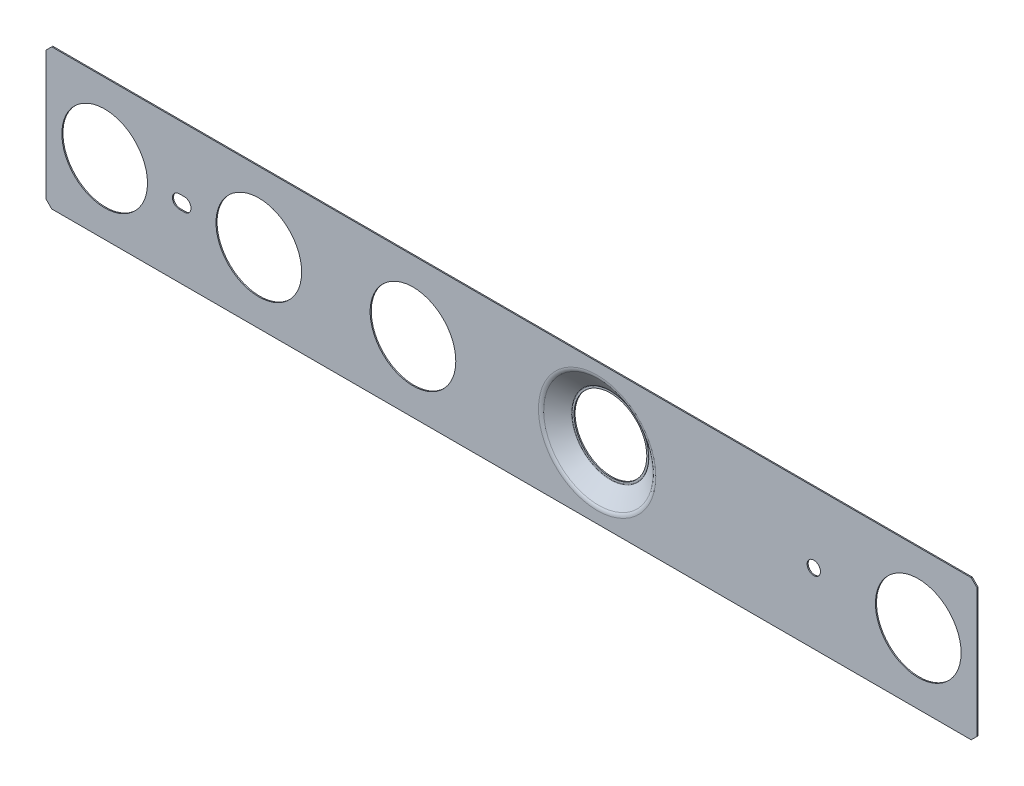
ISO-10303-21;
HEADER;
FILE_DESCRIPTION(('STEP AP214'),'2;1');
FILE_NAME('part.step','',(''),(''),'','','');
FILE_SCHEMA(('AUTOMOTIVE_DESIGN { 1 0 10303 214 1 1 1 1 }'));
ENDSEC;
DATA;
#1=APPLICATION_CONTEXT('core data for automotive mechanical design processes');
#2=APPLICATION_PROTOCOL_DEFINITION('international standard','automotive_design',2000,#1);
#3=PRODUCT_CONTEXT('',#1,'mechanical');
#4=PRODUCT('Part','Part','',(#3));
#5=PRODUCT_RELATED_PRODUCT_CATEGORY('part','',(#4));
#6=PRODUCT_DEFINITION_FORMATION('','',#4);
#7=PRODUCT_DEFINITION_CONTEXT('part definition',#1,'design');
#8=PRODUCT_DEFINITION('design','',#6,#7);
#9=PRODUCT_DEFINITION_SHAPE('','',#8);
#10=(LENGTH_UNIT() NAMED_UNIT(*) SI_UNIT(.MILLI.,.METRE.));
#11=(NAMED_UNIT(*) PLANE_ANGLE_UNIT() SI_UNIT($,.RADIAN.));
#12=(NAMED_UNIT(*) SI_UNIT($,.STERADIAN.) SOLID_ANGLE_UNIT());
#13=UNCERTAINTY_MEASURE_WITH_UNIT(LENGTH_MEASURE(1.E-05),#10,'distance_accuracy_value','');
#14=(GEOMETRIC_REPRESENTATION_CONTEXT(3) GLOBAL_UNCERTAINTY_ASSIGNED_CONTEXT((#13)) GLOBAL_UNIT_ASSIGNED_CONTEXT((#10,
#11,#12)) REPRESENTATION_CONTEXT('',''));
#15=CARTESIAN_POINT('',(0.,0.,0.));
#16=DIRECTION('',(0.,0.,1.));
#17=DIRECTION('',(1.,0.,0.));
#18=AXIS2_PLACEMENT_3D('',#15,#16,#17);
#19=CARTESIAN_POINT('',(10.,0.,-3.87));
#20=DIRECTION('',(0.,0.,1.));
#21=DIRECTION('',(1.,0.,0.));
#22=AXIS2_PLACEMENT_3D('',#19,#20,#21);
#23=PLANE('',#22);
#24=CARTESIAN_POINT('',(10.,0.,-3.87));
#25=DIRECTION('',(0.,0.,1.));
#26=DIRECTION('',(1.,0.,0.));
#27=AXIS2_PLACEMENT_3D('',#24,#25,#26);
#28=CIRCLE('',#27,4.25);
#29=CARTESIAN_POINT('',(14.25,0.,-3.87));
#30=VERTEX_POINT('',#29);
#31=EDGE_CURVE('E235',#30,#30,#28,.F.);
#32=ORIENTED_EDGE('',*,*,#31,.T.);
#33=EDGE_LOOP('',(#32));
#34=FACE_BOUND('',#33,.T.);
#35=CARTESIAN_POINT('',(10.,0.,-3.87));
#36=DIRECTION('',(0.,0.,-1.));
#37=DIRECTION('',(0.,1.,0.));
#38=AXIS2_PLACEMENT_3D('',#35,#36,#37);
#39=CIRCLE('',#38,4.45);
#40=CARTESIAN_POINT('',(10.,-4.45,-3.87));
#41=VERTEX_POINT('',#40);
#42=CARTESIAN_POINT('',(10.,4.45,-3.87));
#43=VERTEX_POINT('',#42);
#44=EDGE_CURVE('E226',#41,#43,#39,.F.);
#45=ORIENTED_EDGE('',*,*,#44,.T.);
#46=CARTESIAN_POINT('',(10.,0.,-3.87));
#47=DIRECTION('',(0.,0.,-1.));
#48=DIRECTION('',(0.,-1.,0.));
#49=AXIS2_PLACEMENT_3D('',#46,#47,#48);
#50=CIRCLE('',#49,4.45);
#51=EDGE_CURVE('E230',#43,#41,#50,.F.);
#52=ORIENTED_EDGE('',*,*,#51,.T.);
#53=EDGE_LOOP('',(#45,#52));
#54=FACE_BOUND('',#53,.T.);
#55=ADVANCED_FACE('F17',(#34,#54),#23,.T.);
#56=CARTESIAN_POINT('',(10.,0.,-3.77));
#57=DIRECTION('',(0.,0.,1.));
#58=DIRECTION('',(0.,1.,0.));
#59=AXIS2_PLACEMENT_3D('',#56,#57,#58);
#60=TOROIDAL_SURFACE('',#59,4.45,0.1);
#61=ORIENTED_EDGE('',*,*,#51,.F.);
#62=ORIENTED_EDGE('',*,*,#44,.F.);
#63=EDGE_LOOP('',(#61,#62));
#64=FACE_BOUND('',#63,.T.);
#65=CARTESIAN_POINT('',(10.,0.,-3.8505370571329));
#66=DIRECTION('',(0.,0.,1.));
#67=DIRECTION('',(0.,1.,0.));
#68=AXIS2_PLACEMENT_3D('',#65,#66,#67);
#69=CIRCLE('',#68,4.50927716616434);
#70=CARTESIAN_POINT('',(10.,4.50927716616434,-3.8505370571329));
#71=VERTEX_POINT('',#70);
#72=EDGE_CURVE('E266',#71,#71,#69,.T.);
#73=ORIENTED_EDGE('',*,*,#72,.T.);
#74=EDGE_LOOP('',(#73));
#75=FACE_BOUND('',#74,.T.);
#76=ADVANCED_FACE('F228',(#64,#75),#60,.F.);
#77=CARTESIAN_POINT('',(10.,0.,-4.079));
#78=DIRECTION('',(0.,0.,1.));
#79=DIRECTION('',(1.,0.,0.));
#80=AXIS2_PLACEMENT_3D('',#77,#78,#79);
#81=CYLINDRICAL_SURFACE('',#80,4.25);
#82=ORIENTED_EDGE('',*,*,#31,.F.);
#83=EDGE_LOOP('',(#82));
#84=FACE_BOUND('',#83,.T.);
#85=CARTESIAN_POINT('',(10.,0.,-3.995));
#86=DIRECTION('',(0.,0.,1.));
#87=DIRECTION('',(1.,0.,0.));
#88=AXIS2_PLACEMENT_3D('',#85,#86,#87);
#89=CIRCLE('',#88,4.25);
#90=CARTESIAN_POINT('',(14.25,0.,-3.995));
#91=VERTEX_POINT('',#90);
#92=EDGE_CURVE('E269',#91,#91,#89,.F.);
#93=ORIENTED_EDGE('',*,*,#92,.T.);
#94=EDGE_LOOP('',(#93));
#95=FACE_BOUND('',#94,.T.);
#96=ADVANCED_FACE('F262',(#84,#95),#81,.F.);
#97=CARTESIAN_POINT('',(10.,0.,-2.46583780739229));
#98=DIRECTION('',(0.,0.,1.));
#99=DIRECTION('',(1.,0.,0.));
#100=AXIS2_PLACEMENT_3D('',#97,#98,#99);
#101=CONICAL_SURFACE('',#100,6.39060196198216,0.93630035294588);
#102=ORIENTED_EDGE('',*,*,#72,.F.);
#103=EDGE_LOOP('',(#102));
#104=FACE_BOUND('',#103,.T.);
#105=CARTESIAN_POINT('',(10.,0.,-2.46583780733411));
#106=DIRECTION('',(0.,0.,1.));
#107=DIRECTION('',(0.,1.,0.));
#108=AXIS2_PLACEMENT_3D('',#105,#106,#107);
#109=CIRCLE('',#108,6.39060196207808);
#110=CARTESIAN_POINT('',(10.,6.39060196207808,-2.46583780733411));
#111=VERTEX_POINT('',#110);
#112=EDGE_CURVE('E270',#111,#111,#109,.F.);
#113=ORIENTED_EDGE('',*,*,#112,.F.);
#114=EDGE_LOOP('',(#113));
#115=FACE_BOUND('',#114,.T.);
#116=ADVANCED_FACE('F476',(#104,#115),#101,.F.);
#117=CARTESIAN_POINT('',(10.,0.,-3.995));
#118=DIRECTION('',(0.,0.,1.));
#119=DIRECTION('',(1.,0.,0.));
#120=AXIS2_PLACEMENT_3D('',#117,#118,#119);
#121=PLANE('',#120);
#122=ORIENTED_EDGE('',*,*,#92,.F.);
#123=EDGE_LOOP('',(#122));
#124=FACE_BOUND('',#123,.T.);
#125=CARTESIAN_POINT('',(10.,0.,-3.995));
#126=DIRECTION('',(0.,0.,1.));
#127=DIRECTION('',(0.,-1.,0.));
#128=AXIS2_PLACEMENT_3D('',#125,#126,#127);
#129=CIRCLE('',#128,4.45);
#130=CARTESIAN_POINT('',(10.,-4.45,-3.995));
#131=VERTEX_POINT('',#130);
#132=CARTESIAN_POINT('',(10.,4.45,-3.995));
#133=VERTEX_POINT('',#132);
#134=EDGE_CURVE('E285',#131,#133,#129,.T.);
#135=ORIENTED_EDGE('',*,*,#134,.F.);
#136=CARTESIAN_POINT('',(10.,0.,-3.995));
#137=DIRECTION('',(0.,0.,1.));
#138=DIRECTION('',(0.,1.,0.));
#139=AXIS2_PLACEMENT_3D('',#136,#137,#138);
#140=CIRCLE('',#139,4.45);
#141=EDGE_CURVE('E273',#133,#131,#140,.T.);
#142=ORIENTED_EDGE('',*,*,#141,.F.);
#143=EDGE_LOOP('',(#135,#142));
#144=FACE_BOUND('',#143,.T.);
#145=ADVANCED_FACE('F206',(#124,#144),#121,.F.);
#146=CARTESIAN_POINT('',(10.,0.,-3.09));
#147=DIRECTION('',(0.,0.,1.));
#148=DIRECTION('',(0.,1.,0.));
#149=AXIS2_PLACEMENT_3D('',#146,#147,#148);
#150=TOROIDAL_SURFACE('',#149,6.85,0.775);
#151=ORIENTED_EDGE('',*,*,#112,.T.);
#152=EDGE_LOOP('',(#151));
#153=FACE_BOUND('',#152,.T.);
#154=CARTESIAN_POINT('',(10.,0.,-2.315));
#155=DIRECTION('',(0.,0.,1.));
#156=DIRECTION('',(0.,1.,0.));
#157=AXIS2_PLACEMENT_3D('',#154,#155,#156);
#158=CIRCLE('',#157,6.85);
#159=CARTESIAN_POINT('',(10.,-6.85,-2.315));
#160=VERTEX_POINT('',#159);
#161=CARTESIAN_POINT('',(10.,6.85,-2.315));
#162=VERTEX_POINT('',#161);
#163=EDGE_CURVE('E196',#160,#162,#158,.F.);
#164=ORIENTED_EDGE('',*,*,#163,.F.);
#165=CARTESIAN_POINT('',(10.,0.,-2.315));
#166=DIRECTION('',(0.,0.,1.));
#167=DIRECTION('',(0.,-1.,0.));
#168=AXIS2_PLACEMENT_3D('',#165,#166,#167);
#169=CIRCLE('',#168,6.85);
#170=EDGE_CURVE('E160',#162,#160,#169,.F.);
#171=ORIENTED_EDGE('',*,*,#170,.F.);
#172=EDGE_LOOP('',(#164,#171));
#173=FACE_BOUND('',#172,.T.);
#174=ADVANCED_FACE('F202',(#153,#173),#150,.T.);
#175=CARTESIAN_POINT('',(10.,0.,-3.77));
#176=DIRECTION('',(0.,0.,1.));
#177=DIRECTION('',(0.,1.,0.));
#178=AXIS2_PLACEMENT_3D('',#175,#176,#177);
#179=TOROIDAL_SURFACE('',#178,4.45,0.225);
#180=ORIENTED_EDGE('',*,*,#141,.T.);
#181=ORIENTED_EDGE('',*,*,#134,.T.);
#182=EDGE_LOOP('',(#180,#181));
#183=FACE_BOUND('',#182,.T.);
#184=CARTESIAN_POINT('',(10.,0.,-3.95120837850982));
#185=DIRECTION('',(0.,0.,1.));
#186=DIRECTION('',(0.,1.,0.));
#187=AXIS2_PLACEMENT_3D('',#184,#185,#186);
#188=CIRCLE('',#187,4.58337362397288);
#189=CARTESIAN_POINT('',(10.,4.58337362397288,-3.95120837850982));
#190=VERTEX_POINT('',#189);
#191=EDGE_CURVE('E138',#190,#190,#188,.T.);
#192=ORIENTED_EDGE('',*,*,#191,.F.);
#193=EDGE_LOOP('',(#192));
#194=FACE_BOUND('',#193,.T.);
#195=ADVANCED_FACE('F177',(#183,#194),#179,.T.);
#196=CARTESIAN_POINT('',(0.,0.,-2.315));
#197=DIRECTION('',(0.,0.,1.));
#198=DIRECTION('',(1.,0.,0.));
#199=AXIS2_PLACEMENT_3D('',#196,#197,#198);
#200=PLANE('',#199);
#201=ORIENTED_EDGE('',*,*,#170,.T.);
#202=ORIENTED_EDGE('',*,*,#163,.T.);
#203=EDGE_LOOP('',(#201,#202));
#204=FACE_BOUND('',#203,.T.);
#205=CARTESIAN_POINT('',(-38.8,0.,-2.315));
#206=DIRECTION('',(0.,0.,1.));
#207=DIRECTION('',(1.,0.,0.));
#208=AXIS2_PLACEMENT_3D('',#205,#206,#207);
#209=CIRCLE('',#208,0.78);
#210=CARTESIAN_POINT('',(-38.8,-0.78,-2.315));
#211=VERTEX_POINT('',#210);
#212=CARTESIAN_POINT('',(-38.8,0.78,-2.315));
#213=VERTEX_POINT('',#212);
#214=EDGE_CURVE('E352',#211,#213,#209,.F.);
#215=ORIENTED_EDGE('',*,*,#214,.T.);
#216=DIRECTION('',(1.,0.,0.));
#217=VECTOR('',#216,1.);
#218=CARTESIAN_POINT('',(-38.2,0.78,-2.315));
#219=LINE('',#218,#217);
#220=CARTESIAN_POINT('',(-38.2,0.78,-2.315));
#221=VERTEX_POINT('',#220);
#222=EDGE_CURVE('E153',#213,#221,#219,.T.);
#223=ORIENTED_EDGE('',*,*,#222,.T.);
#224=CARTESIAN_POINT('',(-38.2,0.,-2.315));
#225=DIRECTION('',(0.,0.,1.));
#226=DIRECTION('',(1.,0.,0.));
#227=AXIS2_PLACEMENT_3D('',#224,#225,#226);
#228=CIRCLE('',#227,0.78);
#229=CARTESIAN_POINT('',(-38.2,-0.78,-2.315));
#230=VERTEX_POINT('',#229);
#231=EDGE_CURVE('E83',#221,#230,#228,.F.);
#232=ORIENTED_EDGE('',*,*,#231,.T.);
#233=DIRECTION('',(1.,0.,0.));
#234=VECTOR('',#233,1.);
#235=CARTESIAN_POINT('',(-38.8,-0.78,-2.315));
#236=LINE('',#235,#234);
#237=EDGE_CURVE('E186',#230,#211,#236,.F.);
#238=ORIENTED_EDGE('',*,*,#237,.T.);
#239=EDGE_LOOP('',(#215,#223,#232,#238));
#240=FACE_BOUND('',#239,.T.);
#241=CARTESIAN_POINT('',(35.3,0.,-2.315));
#242=DIRECTION('',(0.,0.,1.));
#243=DIRECTION('',(1.,0.,0.));
#244=AXIS2_PLACEMENT_3D('',#241,#242,#243);
#245=CIRCLE('',#244,0.78);
#246=CARTESIAN_POINT('',(36.08,0.,-2.315));
#247=VERTEX_POINT('',#246);
#248=EDGE_CURVE('E156',#247,#247,#245,.F.);
#249=ORIENTED_EDGE('',*,*,#248,.T.);
#250=EDGE_LOOP('',(#249));
#251=FACE_BOUND('',#250,.T.);
#252=CARTESIAN_POINT('',(47.5,0.,-2.315));
#253=DIRECTION('',(0.,0.,1.));
#254=DIRECTION('',(1.,0.,0.));
#255=AXIS2_PLACEMENT_3D('',#252,#253,#254);
#256=CIRCLE('',#255,5.);
#257=CARTESIAN_POINT('',(52.5,0.,-2.315));
#258=VERTEX_POINT('',#257);
#259=EDGE_CURVE('E458',#258,#258,#256,.F.);
#260=ORIENTED_EDGE('',*,*,#259,.T.);
#261=EDGE_LOOP('',(#260));
#262=FACE_BOUND('',#261,.T.);
#263=CARTESIAN_POINT('',(-47.5,0.,-2.315));
#264=DIRECTION('',(0.,0.,1.));
#265=DIRECTION('',(1.,0.,0.));
#266=AXIS2_PLACEMENT_3D('',#263,#264,#265);
#267=CIRCLE('',#266,5.);
#268=CARTESIAN_POINT('',(-42.5,0.,-2.315));
#269=VERTEX_POINT('',#268);
#270=EDGE_CURVE('E461',#269,#269,#267,.F.);
#271=ORIENTED_EDGE('',*,*,#270,.T.);
#272=EDGE_LOOP('',(#271));
#273=FACE_BOUND('',#272,.T.);
#274=CARTESIAN_POINT('',(-11.5,0.,-2.315));
#275=DIRECTION('',(0.,0.,1.));
#276=DIRECTION('',(1.,0.,0.));
#277=AXIS2_PLACEMENT_3D('',#274,#275,#276);
#278=CIRCLE('',#277,5.);
#279=CARTESIAN_POINT('',(-6.5,0.,-2.315));
#280=VERTEX_POINT('',#279);
#281=EDGE_CURVE('E464',#280,#280,#278,.F.);
#282=ORIENTED_EDGE('',*,*,#281,.T.);
#283=EDGE_LOOP('',(#282));
#284=FACE_BOUND('',#283,.T.);
#285=CARTESIAN_POINT('',(-29.5,0.,-2.315));
#286=DIRECTION('',(0.,0.,1.));
#287=DIRECTION('',(1.,0.,0.));
#288=AXIS2_PLACEMENT_3D('',#285,#286,#287);
#289=CIRCLE('',#288,5.);
#290=CARTESIAN_POINT('',(-24.5,0.,-2.315));
#291=VERTEX_POINT('',#290);
#292=EDGE_CURVE('E360',#291,#291,#289,.F.);
#293=ORIENTED_EDGE('',*,*,#292,.T.);
#294=EDGE_LOOP('',(#293));
#295=FACE_BOUND('',#294,.T.);
#296=DIRECTION('',(-0.707106781186548,0.707106781186548,0.));
#297=VECTOR('',#296,1.);
#298=CARTESIAN_POINT('',(54.35,7.532893218813,-2.315));
#299=LINE('',#298,#297);
#300=CARTESIAN_POINT('',(53.6828932188104,8.20000000000038,-2.315));
#301=VERTEX_POINT('',#300);
#302=CARTESIAN_POINT('',(54.3500000000001,7.53289321881213,-2.315));
#303=VERTEX_POINT('',#302);
#304=EDGE_CURVE('E95',#301,#303,#299,.F.);
#305=ORIENTED_EDGE('',*,*,#304,.F.);
#306=DIRECTION('',(1.,0.,0.));
#307=VECTOR('',#306,1.);
#308=CARTESIAN_POINT('',(53.68289321881,8.2,-2.315));
#309=LINE('',#308,#307);
#310=CARTESIAN_POINT('',(-53.68289321881,8.2,-2.315));
#311=VERTEX_POINT('',#310);
#312=EDGE_CURVE('E133',#311,#301,#309,.T.);
#313=ORIENTED_EDGE('',*,*,#312,.F.);
#314=DIRECTION('',(-0.707106781186548,-0.707106781186548,0.));
#315=VECTOR('',#314,1.);
#316=CARTESIAN_POINT('',(-53.68289321881,8.2,-2.315));
#317=LINE('',#316,#315);
#318=CARTESIAN_POINT('',(-54.3499999999996,7.53289321881262,-2.315));
#319=VERTEX_POINT('',#318);
#320=EDGE_CURVE('E122',#319,#311,#317,.F.);
#321=ORIENTED_EDGE('',*,*,#320,.F.);
#322=DIRECTION('',(0.,1.,0.));
#323=VECTOR('',#322,1.);
#324=CARTESIAN_POINT('',(-54.35,7.532893218813,-2.315));
#325=LINE('',#324,#323);
#326=CARTESIAN_POINT('',(-54.3500000000001,-7.53289321881213,-2.315));
#327=VERTEX_POINT('',#326);
#328=EDGE_CURVE('E144',#327,#319,#325,.T.);
#329=ORIENTED_EDGE('',*,*,#328,.F.);
#330=DIRECTION('',(0.707106781186548,-0.707106781186548,0.));
#331=VECTOR('',#330,1.);
#332=CARTESIAN_POINT('',(-54.35,-7.532893218813,-2.315));
#333=LINE('',#332,#331);
#334=CARTESIAN_POINT('',(-53.6828932188104,-8.20000000000038,-2.315));
#335=VERTEX_POINT('',#334);
#336=EDGE_CURVE('E382',#335,#327,#333,.F.);
#337=ORIENTED_EDGE('',*,*,#336,.F.);
#338=DIRECTION('',(1.,0.,0.));
#339=VECTOR('',#338,1.);
#340=CARTESIAN_POINT('',(-53.68289321881,-8.2,-2.315));
#341=LINE('',#340,#339);
#342=CARTESIAN_POINT('',(53.68289321881,-8.2,-2.315));
#343=VERTEX_POINT('',#342);
#344=EDGE_CURVE('E377',#343,#335,#341,.F.);
#345=ORIENTED_EDGE('',*,*,#344,.F.);
#346=DIRECTION('',(0.707106781186548,0.707106781186548,0.));
#347=VECTOR('',#346,1.);
#348=CARTESIAN_POINT('',(53.68289321881,-8.2,-2.315));
#349=LINE('',#348,#347);
#350=CARTESIAN_POINT('',(54.3499999999996,-7.53289321881262,-2.315));
#351=VERTEX_POINT('',#350);
#352=EDGE_CURVE('E372',#351,#343,#349,.F.);
#353=ORIENTED_EDGE('',*,*,#352,.F.);
#354=DIRECTION('',(0.,1.,0.));
#355=VECTOR('',#354,1.);
#356=CARTESIAN_POINT('',(54.35,-7.532893218813,-2.315));
#357=LINE('',#356,#355);
#358=EDGE_CURVE('E367',#303,#351,#357,.F.);
#359=ORIENTED_EDGE('',*,*,#358,.F.);
#360=EDGE_LOOP('',(#305,#313,#321,#329,#337,#345,#353,#359));
#361=FACE_BOUND('',#360,.T.);
#362=ADVANCED_FACE('F135',(#204,#240,#251,#262,#273,#284,#295,#361),#200,.T.);
#363=CARTESIAN_POINT('',(10.,0.,-2.56650912876921));
#364=DIRECTION('',(0.,0.,1.));
#365=DIRECTION('',(1.,0.,0.));
#366=AXIS2_PLACEMENT_3D('',#363,#364,#365);
#367=CONICAL_SURFACE('',#366,6.46469841979069,0.93630035294588);
#368=ORIENTED_EDGE('',*,*,#191,.T.);
#369=EDGE_LOOP('',(#368));
#370=FACE_BOUND('',#369,.T.);
#371=CARTESIAN_POINT('',(10.,0.,-2.56650912873209));
#372=DIRECTION('',(0.,0.,1.));
#373=DIRECTION('',(0.,1.,0.));
#374=AXIS2_PLACEMENT_3D('',#371,#372,#373);
#375=CIRCLE('',#374,6.46469841980707);
#376=CARTESIAN_POINT('',(10.,6.46469841980707,-2.56650912873209));
#377=VERTEX_POINT('',#376);
#378=EDGE_CURVE('E149',#377,#377,#375,.F.);
#379=ORIENTED_EDGE('',*,*,#378,.T.);
#380=EDGE_LOOP('',(#379));
#381=FACE_BOUND('',#380,.T.);
#382=ADVANCED_FACE('F176',(#370,#381),#367,.T.);
#383=CARTESIAN_POINT('',(53.68289321881,8.2,-2.44));
#384=DIRECTION('',(0.,1.,0.));
#385=DIRECTION('',(0.,0.,1.));
#386=AXIS2_PLACEMENT_3D('',#383,#384,#385);
#387=PLANE('',#386);
#388=DIRECTION('',(0.,0.,1.));
#389=VECTOR('',#388,1.);
#390=CARTESIAN_POINT('',(53.6828932188115,8.2000000000015,-2.44));
#391=LINE('',#390,#389);
#392=CARTESIAN_POINT('',(53.6828932188104,8.20000000000037,-2.44));
#393=VERTEX_POINT('',#392);
#394=EDGE_CURVE('E362',#393,#301,#391,.T.);
#395=ORIENTED_EDGE('',*,*,#394,.F.);
#396=DIRECTION('',(1.,0.,0.));
#397=VECTOR('',#396,1.);
#398=CARTESIAN_POINT('',(0.,8.2,-2.44));
#399=LINE('',#398,#397);
#400=CARTESIAN_POINT('',(-53.68289321881,8.2,-2.44));
#401=VERTEX_POINT('',#400);
#402=EDGE_CURVE('E143',#393,#401,#399,.F.);
#403=ORIENTED_EDGE('',*,*,#402,.T.);
#404=DIRECTION('',(0.,0.,1.));
#405=VECTOR('',#404,1.);
#406=CARTESIAN_POINT('',(-53.68289321881,8.2,-2.44));
#407=LINE('',#406,#405);
#408=EDGE_CURVE('E127',#311,#401,#407,.F.);
#409=ORIENTED_EDGE('',*,*,#408,.F.);
#410=ORIENTED_EDGE('',*,*,#312,.T.);
#411=EDGE_LOOP('',(#395,#403,#409,#410));
#412=FACE_BOUND('',#411,.T.);
#413=ADVANCED_FACE('F141',(#412),#387,.T.);
#414=CARTESIAN_POINT('',(-53.68289321881,8.2,-2.44));
#415=DIRECTION('',(-0.707106781186548,0.707106781186548,0.));
#416=DIRECTION('',(-0.707106781186548,-0.707106781186548,0.));
#417=AXIS2_PLACEMENT_3D('',#414,#415,#416);
#418=PLANE('',#417);
#419=ORIENTED_EDGE('',*,*,#408,.T.);
#420=DIRECTION('',(-0.707106781188139,-0.707106781184956,0.));
#421=VECTOR('',#420,1.);
#422=CARTESIAN_POINT('',(-53.68289321881,8.2,-2.44));
#423=LINE('',#422,#421);
#424=CARTESIAN_POINT('',(-54.3499999999993,7.53289321881225,-2.44));
#425=VERTEX_POINT('',#424);
#426=EDGE_CURVE('E395',#401,#425,#423,.T.);
#427=ORIENTED_EDGE('',*,*,#426,.T.);
#428=DIRECTION('',(0.,0.,1.));
#429=VECTOR('',#428,1.);
#430=CARTESIAN_POINT('',(-54.35,7.532893218813,-2.44));
#431=LINE('',#430,#429);
#432=EDGE_CURVE('E130',#319,#425,#431,.F.);
#433=ORIENTED_EDGE('',*,*,#432,.F.);
#434=ORIENTED_EDGE('',*,*,#320,.T.);
#435=EDGE_LOOP('',(#419,#427,#433,#434));
#436=FACE_BOUND('',#435,.T.);
#437=ADVANCED_FACE('F124',(#436),#418,.T.);
#438=CARTESIAN_POINT('',(-54.35,7.532893218813,-2.44));
#439=DIRECTION('',(-1.,0.,0.));
#440=DIRECTION('',(0.,0.,1.));
#441=AXIS2_PLACEMENT_3D('',#438,#439,#440);
#442=PLANE('',#441);
#443=ORIENTED_EDGE('',*,*,#432,.T.);
#444=DIRECTION('',(0.,1.,0.));
#445=VECTOR('',#444,1.);
#446=CARTESIAN_POINT('',(-54.35,0.,-2.44));
#447=LINE('',#446,#445);
#448=CARTESIAN_POINT('',(-54.3500000000001,-7.53289321881213,-2.44));
#449=VERTEX_POINT('',#448);
#450=EDGE_CURVE('E390',#425,#449,#447,.F.);
#451=ORIENTED_EDGE('',*,*,#450,.T.);
#452=DIRECTION('',(0.,0.,1.));
#453=VECTOR('',#452,1.);
#454=CARTESIAN_POINT('',(-54.3500000000005,-7.5328932188125,-2.44));
#455=LINE('',#454,#453);
#456=EDGE_CURVE('E379',#327,#449,#455,.F.);
#457=ORIENTED_EDGE('',*,*,#456,.F.);
#458=ORIENTED_EDGE('',*,*,#328,.T.);
#459=EDGE_LOOP('',(#443,#451,#457,#458));
#460=FACE_BOUND('',#459,.T.);
#461=ADVANCED_FACE('F387',(#460),#442,.T.);
#462=CARTESIAN_POINT('',(-54.35,-7.532893218813,-2.44));
#463=DIRECTION('',(-0.707106781186548,-0.707106781186548,0.));
#464=DIRECTION('',(0.707106781186548,-0.707106781186548,0.));
#465=AXIS2_PLACEMENT_3D('',#462,#463,#464);
#466=PLANE('',#465);
#467=ORIENTED_EDGE('',*,*,#456,.T.);
#468=DIRECTION('',(0.707106781187609,-0.707106781185486,0.));
#469=VECTOR('',#468,1.);
#470=CARTESIAN_POINT('',(-54.35,-7.532893218812,-2.44));
#471=LINE('',#470,#469);
#472=CARTESIAN_POINT('',(-53.6828932188107,-8.20000000000075,-2.44));
#473=VERTEX_POINT('',#472);
#474=EDGE_CURVE('E398',#449,#473,#471,.T.);
#475=ORIENTED_EDGE('',*,*,#474,.T.);
#476=DIRECTION('',(0.,0.,-1.));
#477=VECTOR('',#476,1.);
#478=CARTESIAN_POINT('',(-53.68289321881,-8.2,-2.44));
#479=LINE('',#478,#477);
#480=EDGE_CURVE('E374',#335,#473,#479,.T.);
#481=ORIENTED_EDGE('',*,*,#480,.F.);
#482=ORIENTED_EDGE('',*,*,#336,.T.);
#483=EDGE_LOOP('',(#467,#475,#481,#482));
#484=FACE_BOUND('',#483,.T.);
#485=ADVANCED_FACE('F589',(#484),#466,.T.);
#486=CARTESIAN_POINT('',(-53.68289321881,-8.2,-2.44));
#487=DIRECTION('',(0.,-1.,0.));
#488=DIRECTION('',(0.,0.,-1.));
#489=AXIS2_PLACEMENT_3D('',#486,#487,#488);
#490=PLANE('',#489);
#491=ORIENTED_EDGE('',*,*,#480,.T.);
#492=DIRECTION('',(1.,0.,0.));
#493=VECTOR('',#492,1.);
#494=CARTESIAN_POINT('',(0.,-8.2,-2.44));
#495=LINE('',#494,#493);
#496=CARTESIAN_POINT('',(53.68289321881,-8.2,-2.44));
#497=VERTEX_POINT('',#496);
#498=EDGE_CURVE('E402',#473,#497,#495,.T.);
#499=ORIENTED_EDGE('',*,*,#498,.T.);
#500=DIRECTION('',(0.,0.,1.));
#501=VECTOR('',#500,1.);
#502=CARTESIAN_POINT('',(53.68289321881,-8.2,-2.44));
#503=LINE('',#502,#501);
#504=EDGE_CURVE('E369',#343,#497,#503,.F.);
#505=ORIENTED_EDGE('',*,*,#504,.F.);
#506=ORIENTED_EDGE('',*,*,#344,.T.);
#507=EDGE_LOOP('',(#491,#499,#505,#506));
#508=FACE_BOUND('',#507,.T.);
#509=ADVANCED_FACE('F581',(#508),#490,.T.);
#510=CARTESIAN_POINT('',(53.68289321881,-8.2,-2.44));
#511=DIRECTION('',(0.707106781186548,-0.707106781186548,0.));
#512=DIRECTION('',(0.707106781186548,0.707106781186548,0.));
#513=AXIS2_PLACEMENT_3D('',#510,#511,#512);
#514=PLANE('',#513);
#515=ORIENTED_EDGE('',*,*,#504,.T.);
#516=DIRECTION('',(0.707106781188139,0.707106781184956,0.));
#517=VECTOR('',#516,1.);
#518=CARTESIAN_POINT('',(53.68289321881,-8.2,-2.44));
#519=LINE('',#518,#517);
#520=CARTESIAN_POINT('',(54.3499999999993,-7.53289321881225,-2.44));
#521=VERTEX_POINT('',#520);
#522=EDGE_CURVE('E405',#497,#521,#519,.T.);
#523=ORIENTED_EDGE('',*,*,#522,.T.);
#524=DIRECTION('',(0.,0.,-1.));
#525=VECTOR('',#524,1.);
#526=CARTESIAN_POINT('',(54.35,-7.532893218813,-2.44));
#527=LINE('',#526,#525);
#528=EDGE_CURVE('E364',#351,#521,#527,.T.);
#529=ORIENTED_EDGE('',*,*,#528,.F.);
#530=ORIENTED_EDGE('',*,*,#352,.T.);
#531=EDGE_LOOP('',(#515,#523,#529,#530));
#532=FACE_BOUND('',#531,.T.);
#533=ADVANCED_FACE('F573',(#532),#514,.T.);
#534=CARTESIAN_POINT('',(54.35,-7.532893218813,-2.44));
#535=DIRECTION('',(1.,0.,0.));
#536=DIRECTION('',(0.,0.,-1.));
#537=AXIS2_PLACEMENT_3D('',#534,#535,#536);
#538=PLANE('',#537);
#539=ORIENTED_EDGE('',*,*,#528,.T.);
#540=DIRECTION('',(0.,1.,0.));
#541=VECTOR('',#540,1.);
#542=CARTESIAN_POINT('',(54.35,0.,-2.44));
#543=LINE('',#542,#541);
#544=CARTESIAN_POINT('',(54.3500000000001,7.53289321881213,-2.44));
#545=VERTEX_POINT('',#544);
#546=EDGE_CURVE('E408',#521,#545,#543,.T.);
#547=ORIENTED_EDGE('',*,*,#546,.T.);
#548=DIRECTION('',(0.,0.,1.));
#549=VECTOR('',#548,1.);
#550=CARTESIAN_POINT('',(54.3500000000005,7.5328932188125,-2.44));
#551=LINE('',#550,#549);
#552=EDGE_CURVE('E358',#303,#545,#551,.F.);
#553=ORIENTED_EDGE('',*,*,#552,.F.);
#554=ORIENTED_EDGE('',*,*,#358,.T.);
#555=EDGE_LOOP('',(#539,#547,#553,#554));
#556=FACE_BOUND('',#555,.T.);
#557=ADVANCED_FACE('F566',(#556),#538,.T.);
#558=CARTESIAN_POINT('',(54.35,7.532893218813,-2.44));
#559=DIRECTION('',(0.707106781186548,0.707106781186548,0.));
#560=DIRECTION('',(-0.707106781186548,0.707106781186548,0.));
#561=AXIS2_PLACEMENT_3D('',#558,#559,#560);
#562=PLANE('',#561);
#563=ORIENTED_EDGE('',*,*,#552,.T.);
#564=DIRECTION('',(-0.707106781187609,0.707106781185486,0.));
#565=VECTOR('',#564,1.);
#566=CARTESIAN_POINT('',(54.35,7.532893218812,-2.44));
#567=LINE('',#566,#565);
#568=EDGE_CURVE('E411',#545,#393,#567,.T.);
#569=ORIENTED_EDGE('',*,*,#568,.T.);
#570=ORIENTED_EDGE('',*,*,#394,.T.);
#571=ORIENTED_EDGE('',*,*,#304,.T.);
#572=EDGE_LOOP('',(#563,#569,#570,#571));
#573=FACE_BOUND('',#572,.T.);
#574=ADVANCED_FACE('F558',(#573),#562,.T.);
#575=CARTESIAN_POINT('',(-29.5,0.,-2.44));
#576=DIRECTION('',(0.,0.,1.));
#577=DIRECTION('',(1.,0.,0.));
#578=AXIS2_PLACEMENT_3D('',#575,#576,#577);
#579=CYLINDRICAL_SURFACE('',#578,5.);
#580=ORIENTED_EDGE('',*,*,#292,.F.);
#581=EDGE_LOOP('',(#580));
#582=FACE_BOUND('',#581,.T.);
#583=CARTESIAN_POINT('',(-29.5,0.,-2.44));
#584=DIRECTION('',(0.,0.,1.));
#585=DIRECTION('',(1.,0.,0.));
#586=AXIS2_PLACEMENT_3D('',#583,#584,#585);
#587=CIRCLE('',#586,5.);
#588=CARTESIAN_POINT('',(-24.5,0.,-2.44));
#589=VERTEX_POINT('',#588);
#590=EDGE_CURVE('E414',#589,#589,#587,.F.);
#591=ORIENTED_EDGE('',*,*,#590,.T.);
#592=EDGE_LOOP('',(#591));
#593=FACE_BOUND('',#592,.T.);
#594=ADVANCED_FACE('F550',(#582,#593),#579,.F.);
#595=CARTESIAN_POINT('',(-11.5,0.,-2.44));
#596=DIRECTION('',(0.,0.,1.));
#597=DIRECTION('',(1.,0.,0.));
#598=AXIS2_PLACEMENT_3D('',#595,#596,#597);
#599=CYLINDRICAL_SURFACE('',#598,5.);
#600=ORIENTED_EDGE('',*,*,#281,.F.);
#601=EDGE_LOOP('',(#600));
#602=FACE_BOUND('',#601,.T.);
#603=CARTESIAN_POINT('',(-11.5,0.,-2.44));
#604=DIRECTION('',(0.,0.,1.));
#605=DIRECTION('',(1.,0.,0.));
#606=AXIS2_PLACEMENT_3D('',#603,#604,#605);
#607=CIRCLE('',#606,5.);
#608=CARTESIAN_POINT('',(-6.5,0.,-2.44));
#609=VERTEX_POINT('',#608);
#610=EDGE_CURVE('E741',#609,#609,#607,.F.);
#611=ORIENTED_EDGE('',*,*,#610,.T.);
#612=EDGE_LOOP('',(#611));
#613=FACE_BOUND('',#612,.T.);
#614=ADVANCED_FACE('F542',(#602,#613),#599,.F.);
#615=CARTESIAN_POINT('',(-47.5,0.,-2.44));
#616=DIRECTION('',(0.,0.,1.));
#617=DIRECTION('',(1.,0.,0.));
#618=AXIS2_PLACEMENT_3D('',#615,#616,#617);
#619=CYLINDRICAL_SURFACE('',#618,5.);
#620=ORIENTED_EDGE('',*,*,#270,.F.);
#621=EDGE_LOOP('',(#620));
#622=FACE_BOUND('',#621,.T.);
#623=CARTESIAN_POINT('',(-47.5,0.,-2.44));
#624=DIRECTION('',(0.,0.,1.));
#625=DIRECTION('',(1.,0.,0.));
#626=AXIS2_PLACEMENT_3D('',#623,#624,#625);
#627=CIRCLE('',#626,5.);
#628=CARTESIAN_POINT('',(-42.5,0.,-2.44));
#629=VERTEX_POINT('',#628);
#630=EDGE_CURVE('E743',#629,#629,#627,.F.);
#631=ORIENTED_EDGE('',*,*,#630,.T.);
#632=EDGE_LOOP('',(#631));
#633=FACE_BOUND('',#632,.T.);
#634=ADVANCED_FACE('F534',(#622,#633),#619,.F.);
#635=CARTESIAN_POINT('',(47.5,0.,-2.44));
#636=DIRECTION('',(0.,0.,1.));
#637=DIRECTION('',(1.,0.,0.));
#638=AXIS2_PLACEMENT_3D('',#635,#636,#637);
#639=CYLINDRICAL_SURFACE('',#638,5.);
#640=ORIENTED_EDGE('',*,*,#259,.F.);
#641=EDGE_LOOP('',(#640));
#642=FACE_BOUND('',#641,.T.);
#643=CARTESIAN_POINT('',(47.5,0.,-2.44));
#644=DIRECTION('',(0.,0.,1.));
#645=DIRECTION('',(1.,0.,0.));
#646=AXIS2_PLACEMENT_3D('',#643,#644,#645);
#647=CIRCLE('',#646,5.);
#648=CARTESIAN_POINT('',(52.5,0.,-2.44));
#649=VERTEX_POINT('',#648);
#650=EDGE_CURVE('E747',#649,#649,#647,.F.);
#651=ORIENTED_EDGE('',*,*,#650,.T.);
#652=EDGE_LOOP('',(#651));
#653=FACE_BOUND('',#652,.T.);
#654=ADVANCED_FACE('F526',(#642,#653),#639,.F.);
#655=CARTESIAN_POINT('',(35.3,0.,-2.315));
#656=DIRECTION('',(0.,0.,1.));
#657=DIRECTION('',(1.,0.,0.));
#658=AXIS2_PLACEMENT_3D('',#655,#656,#657);
#659=CYLINDRICAL_SURFACE('',#658,0.78);
#660=ORIENTED_EDGE('',*,*,#248,.F.);
#661=EDGE_LOOP('',(#660));
#662=FACE_BOUND('',#661,.T.);
#663=CARTESIAN_POINT('',(35.3,0.,-2.44));
#664=DIRECTION('',(0.,0.,1.));
#665=DIRECTION('',(1.,0.,0.));
#666=AXIS2_PLACEMENT_3D('',#663,#664,#665);
#667=CIRCLE('',#666,0.78);
#668=CARTESIAN_POINT('',(36.08,0.,-2.44));
#669=VERTEX_POINT('',#668);
#670=EDGE_CURVE('E419',#669,#669,#667,.F.);
#671=ORIENTED_EDGE('',*,*,#670,.T.);
#672=EDGE_LOOP('',(#671));
#673=FACE_BOUND('',#672,.T.);
#674=ADVANCED_FACE('F519',(#662,#673),#659,.F.);
#675=CARTESIAN_POINT('',(-38.2,0.78,-2.315));
#676=DIRECTION('',(0.,1.,0.));
#677=DIRECTION('',(0.,0.,1.));
#678=AXIS2_PLACEMENT_3D('',#675,#676,#677);
#679=PLANE('',#678);
#680=ORIENTED_EDGE('',*,*,#222,.F.);
#681=DIRECTION('',(0.,0.,1.));
#682=VECTOR('',#681,1.);
#683=CARTESIAN_POINT('',(-38.8,0.78,-2.315));
#684=LINE('',#683,#682);
#685=CARTESIAN_POINT('',(-38.8,0.78,-2.44));
#686=VERTEX_POINT('',#685);
#687=EDGE_CURVE('E152',#213,#686,#684,.F.);
#688=ORIENTED_EDGE('',*,*,#687,.T.);
#689=DIRECTION('',(1.,0.,0.));
#690=VECTOR('',#689,1.);
#691=CARTESIAN_POINT('',(0.,0.78,-2.44));
#692=LINE('',#691,#690);
#693=CARTESIAN_POINT('',(-38.2,0.78,-2.44));
#694=VERTEX_POINT('',#693);
#695=EDGE_CURVE('E415',#686,#694,#692,.T.);
#696=ORIENTED_EDGE('',*,*,#695,.T.);
#697=DIRECTION('',(0.,0.,1.));
#698=VECTOR('',#697,1.);
#699=CARTESIAN_POINT('',(-38.2,0.78,-2.315));
#700=LINE('',#699,#698);
#701=EDGE_CURVE('E155',#694,#221,#700,.T.);
#702=ORIENTED_EDGE('',*,*,#701,.T.);
#703=EDGE_LOOP('',(#680,#688,#696,#702));
#704=FACE_BOUND('',#703,.T.);
#705=ADVANCED_FACE('F449',(#704),#679,.F.);
#706=CARTESIAN_POINT('',(-38.2,0.,-2.315));
#707=DIRECTION('',(0.,0.,1.));
#708=DIRECTION('',(1.,0.,0.));
#709=AXIS2_PLACEMENT_3D('',#706,#707,#708);
#710=CYLINDRICAL_SURFACE('',#709,0.78);
#711=ORIENTED_EDGE('',*,*,#231,.F.);
#712=ORIENTED_EDGE('',*,*,#701,.F.);
#713=CARTESIAN_POINT('',(-38.2,0.,-2.44));
#714=DIRECTION('',(0.,0.,1.));
#715=DIRECTION('',(1.,0.,0.));
#716=AXIS2_PLACEMENT_3D('',#713,#714,#715);
#717=CIRCLE('',#716,0.78);
#718=CARTESIAN_POINT('',(-38.2,-0.78,-2.44));
#719=VERTEX_POINT('',#718);
#720=EDGE_CURVE('E418',#694,#719,#717,.F.);
#721=ORIENTED_EDGE('',*,*,#720,.T.);
#722=DIRECTION('',(0.,0.,-1.));
#723=VECTOR('',#722,1.);
#724=CARTESIAN_POINT('',(-38.2,-0.78,-2.315));
#725=LINE('',#724,#723);
#726=EDGE_CURVE('E194',#719,#230,#725,.F.);
#727=ORIENTED_EDGE('',*,*,#726,.T.);
#728=EDGE_LOOP('',(#711,#712,#721,#727));
#729=FACE_BOUND('',#728,.T.);
#730=ADVANCED_FACE('F506',(#729),#710,.F.);
#731=CARTESIAN_POINT('',(-38.8,-0.78,-2.315));
#732=DIRECTION('',(0.,-1.,0.));
#733=DIRECTION('',(0.,0.,-1.));
#734=AXIS2_PLACEMENT_3D('',#731,#732,#733);
#735=PLANE('',#734);
#736=ORIENTED_EDGE('',*,*,#237,.F.);
#737=ORIENTED_EDGE('',*,*,#726,.F.);
#738=DIRECTION('',(1.,0.,0.));
#739=VECTOR('',#738,1.);
#740=CARTESIAN_POINT('',(0.,-0.78,-2.44));
#741=LINE('',#740,#739);
#742=CARTESIAN_POINT('',(-38.8,-0.78,-2.44));
#743=VERTEX_POINT('',#742);
#744=EDGE_CURVE('E420',#719,#743,#741,.F.);
#745=ORIENTED_EDGE('',*,*,#744,.T.);
#746=DIRECTION('',(0.,0.,1.));
#747=VECTOR('',#746,1.);
#748=CARTESIAN_POINT('',(-38.8,-0.78,-2.315));
#749=LINE('',#748,#747);
#750=EDGE_CURVE('E193',#743,#211,#749,.T.);
#751=ORIENTED_EDGE('',*,*,#750,.T.);
#752=EDGE_LOOP('',(#736,#737,#745,#751));
#753=FACE_BOUND('',#752,.T.);
#754=ADVANCED_FACE('F500',(#753),#735,.F.);
#755=CARTESIAN_POINT('',(-38.8,0.,-2.315));
#756=DIRECTION('',(0.,0.,1.));
#757=DIRECTION('',(1.,0.,0.));
#758=AXIS2_PLACEMENT_3D('',#755,#756,#757);
#759=CYLINDRICAL_SURFACE('',#758,0.78);
#760=ORIENTED_EDGE('',*,*,#214,.F.);
#761=ORIENTED_EDGE('',*,*,#750,.F.);
#762=CARTESIAN_POINT('',(-38.8,0.,-2.44));
#763=DIRECTION('',(0.,0.,1.));
#764=DIRECTION('',(1.,0.,0.));
#765=AXIS2_PLACEMENT_3D('',#762,#763,#764);
#766=CIRCLE('',#765,0.78);
#767=EDGE_CURVE('E251',#743,#686,#766,.F.);
#768=ORIENTED_EDGE('',*,*,#767,.T.);
#769=ORIENTED_EDGE('',*,*,#687,.F.);
#770=EDGE_LOOP('',(#760,#761,#768,#769));
#771=FACE_BOUND('',#770,.T.);
#772=ADVANCED_FACE('F331',(#771),#759,.F.);
#773=CARTESIAN_POINT('',(10.,0.,-3.09));
#774=DIRECTION('',(0.,0.,1.));
#775=DIRECTION('',(0.,1.,0.));
#776=AXIS2_PLACEMENT_3D('',#773,#774,#775);
#777=TOROIDAL_SURFACE('',#776,6.85,0.65);
#778=ORIENTED_EDGE('',*,*,#378,.F.);
#779=EDGE_LOOP('',(#778));
#780=FACE_BOUND('',#779,.T.);
#781=CARTESIAN_POINT('',(10.,0.,-2.44));
#782=DIRECTION('',(0.,0.,-1.));
#783=DIRECTION('',(0.,-1.,0.));
#784=AXIS2_PLACEMENT_3D('',#781,#782,#783);
#785=CIRCLE('',#784,6.85);
#786=CARTESIAN_POINT('',(10.,-6.85,-2.44));
#787=VERTEX_POINT('',#786);
#788=CARTESIAN_POINT('',(10.,6.85,-2.44));
#789=VERTEX_POINT('',#788);
#790=EDGE_CURVE('E28',#787,#789,#785,.T.);
#791=ORIENTED_EDGE('',*,*,#790,.T.);
#792=CARTESIAN_POINT('',(10.,0.,-2.44));
#793=DIRECTION('',(0.,0.,-1.));
#794=DIRECTION('',(0.,1.,0.));
#795=AXIS2_PLACEMENT_3D('',#792,#793,#794);
#796=CIRCLE('',#795,6.85);
#797=EDGE_CURVE('E11',#789,#787,#796,.T.);
#798=ORIENTED_EDGE('',*,*,#797,.T.);
#799=EDGE_LOOP('',(#791,#798));
#800=FACE_BOUND('',#799,.T.);
#801=ADVANCED_FACE('F319',(#780,#800),#777,.F.);
#802=CARTESIAN_POINT('',(0.,0.,-2.44));
#803=DIRECTION('',(0.,0.,1.));
#804=DIRECTION('',(1.,0.,0.));
#805=AXIS2_PLACEMENT_3D('',#802,#803,#804);
#806=PLANE('',#805);
#807=ORIENTED_EDGE('',*,*,#790,.F.);
#808=ORIENTED_EDGE('',*,*,#797,.F.);
#809=EDGE_LOOP('',(#807,#808));
#810=FACE_BOUND('',#809,.T.);
#811=ORIENTED_EDGE('',*,*,#767,.F.);
#812=ORIENTED_EDGE('',*,*,#744,.F.);
#813=ORIENTED_EDGE('',*,*,#720,.F.);
#814=ORIENTED_EDGE('',*,*,#695,.F.);
#815=EDGE_LOOP('',(#811,#812,#813,#814));
#816=FACE_BOUND('',#815,.T.);
#817=ORIENTED_EDGE('',*,*,#670,.F.);
#818=EDGE_LOOP('',(#817));
#819=FACE_BOUND('',#818,.T.);
#820=ORIENTED_EDGE('',*,*,#650,.F.);
#821=EDGE_LOOP('',(#820));
#822=FACE_BOUND('',#821,.T.);
#823=ORIENTED_EDGE('',*,*,#630,.F.);
#824=EDGE_LOOP('',(#823));
#825=FACE_BOUND('',#824,.T.);
#826=ORIENTED_EDGE('',*,*,#610,.F.);
#827=EDGE_LOOP('',(#826));
#828=FACE_BOUND('',#827,.T.);
#829=ORIENTED_EDGE('',*,*,#590,.F.);
#830=EDGE_LOOP('',(#829));
#831=FACE_BOUND('',#830,.T.);
#832=ORIENTED_EDGE('',*,*,#546,.F.);
#833=ORIENTED_EDGE('',*,*,#522,.F.);
#834=ORIENTED_EDGE('',*,*,#498,.F.);
#835=ORIENTED_EDGE('',*,*,#474,.F.);
#836=ORIENTED_EDGE('',*,*,#450,.F.);
#837=ORIENTED_EDGE('',*,*,#426,.F.);
#838=ORIENTED_EDGE('',*,*,#402,.F.);
#839=ORIENTED_EDGE('',*,*,#568,.F.);
#840=EDGE_LOOP('',(#832,#833,#834,#835,#836,#837,#838,#839));
#841=FACE_BOUND('',#840,.T.);
#842=ADVANCED_FACE('F330',(#810,#816,#819,#822,#825,#828,#831,#841),#806,.F.);
#843=CLOSED_SHELL('',(#55,#76,#96,#116,#145,#174,#195,#362,#382,#413,#437,#461,#485,#509,#533,
#557,#574,#594,#614,#634,#654,#674,#705,#730,#754,#772,#801,#842));
#844=MANIFOLD_SOLID_BREP('B1',#843);
#845=ADVANCED_BREP_SHAPE_REPRESENTATION('',(#18,#844),#14);
#846=SHAPE_DEFINITION_REPRESENTATION(#9,#845);
ENDSEC;
END-ISO-10303-21;
